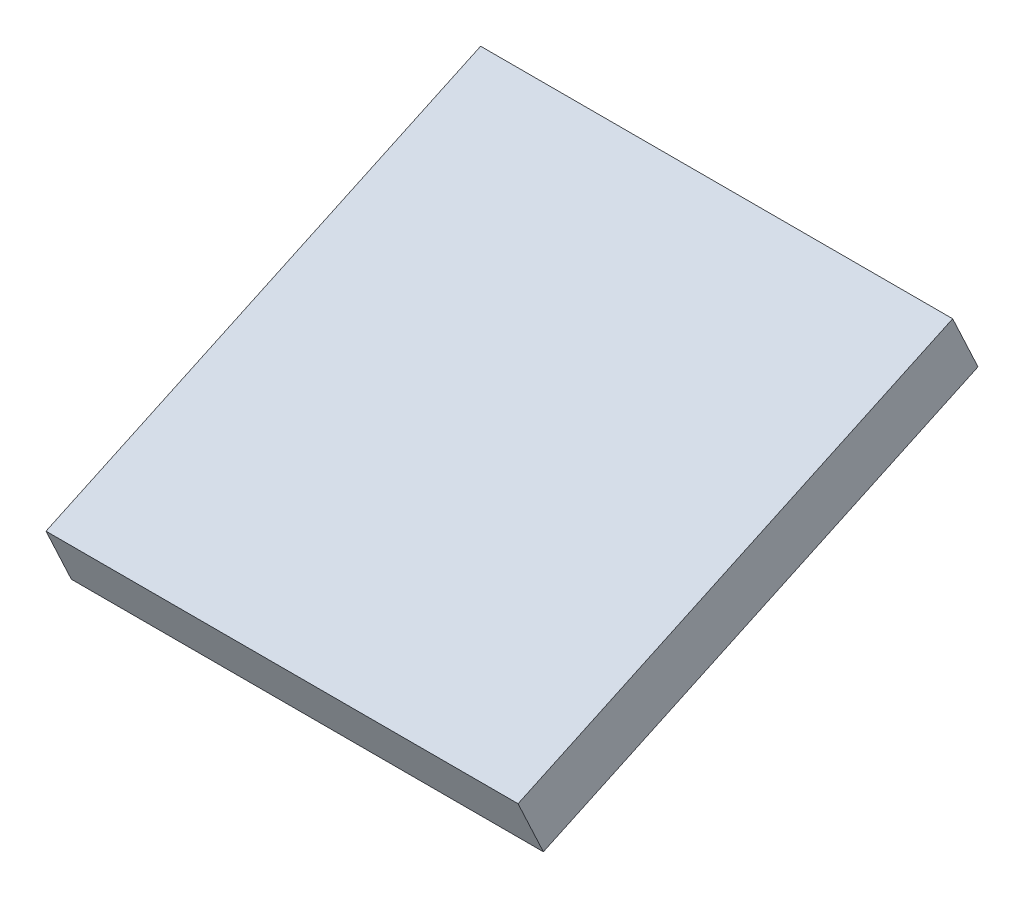
ISO-10303-21;
HEADER;
FILE_DESCRIPTION(('STEP AP214'),'2;1');
FILE_NAME('part.step','',(''),(''),'','','');
FILE_SCHEMA(('AUTOMOTIVE_DESIGN { 1 0 10303 214 1 1 1 1 }'));
ENDSEC;
DATA;
#1=APPLICATION_CONTEXT('core data for automotive mechanical design processes');
#2=APPLICATION_PROTOCOL_DEFINITION('international standard','automotive_design',2000,#1);
#3=PRODUCT_CONTEXT('',#1,'mechanical');
#4=PRODUCT('Part','Part','',(#3));
#5=PRODUCT_RELATED_PRODUCT_CATEGORY('part','',(#4));
#6=PRODUCT_DEFINITION_FORMATION('','',#4);
#7=PRODUCT_DEFINITION_CONTEXT('part definition',#1,'design');
#8=PRODUCT_DEFINITION('design','',#6,#7);
#9=PRODUCT_DEFINITION_SHAPE('','',#8);
#10=(LENGTH_UNIT() NAMED_UNIT(*) SI_UNIT(.MILLI.,.METRE.));
#11=(NAMED_UNIT(*) PLANE_ANGLE_UNIT() SI_UNIT($,.RADIAN.));
#12=(NAMED_UNIT(*) SI_UNIT($,.STERADIAN.) SOLID_ANGLE_UNIT());
#13=UNCERTAINTY_MEASURE_WITH_UNIT(LENGTH_MEASURE(1.E-05),#10,'distance_accuracy_value','');
#14=(GEOMETRIC_REPRESENTATION_CONTEXT(3) GLOBAL_UNCERTAINTY_ASSIGNED_CONTEXT((#13)) GLOBAL_UNIT_ASSIGNED_CONTEXT((#10,
#11,#12)) REPRESENTATION_CONTEXT('',''));
#15=CARTESIAN_POINT('',(0.,0.,0.));
#16=DIRECTION('',(0.,0.,1.));
#17=DIRECTION('',(1.,0.,0.));
#18=AXIS2_PLACEMENT_3D('',#15,#16,#17);
#19=CARTESIAN_POINT('',(-100.0125,42.9380153928551,0.));
#20=DIRECTION('',(0.,0.422618261740701,-0.906307787036649));
#21=DIRECTION('',(0.,0.906307787036649,0.422618261740701));
#22=AXIS2_PLACEMENT_3D('',#19,#20,#21);
#23=PLANE('',#22);
#24=DIRECTION('',(0.,0.906307787036649,0.422618261740701));
#25=VECTOR('',#24,1.);
#26=CARTESIAN_POINT('',(0.,42.9380153928551,0.));
#27=LINE('',#26,#25);
#28=CARTESIAN_POINT('',(0.,42.9380153928551,0.));
#29=VERTEX_POINT('',#28);
#30=CARTESIAN_POINT('',(0.,54.4481242882206,5.36725192410693));
#31=VERTEX_POINT('',#30);
#32=EDGE_CURVE('E97',#29,#31,#27,.T.);
#33=ORIENTED_EDGE('',*,*,#32,.F.);
#34=DIRECTION('',(1.,0.,0.));
#35=VECTOR('',#34,1.);
#36=CARTESIAN_POINT('',(-100.0125,42.9380153928551,0.));
#37=LINE('',#36,#35);
#38=CARTESIAN_POINT('',(-100.0125,42.9380153928551,0.));
#39=VERTEX_POINT('',#38);
#40=EDGE_CURVE('E11',#39,#29,#37,.T.);
#41=ORIENTED_EDGE('',*,*,#40,.F.);
#42=DIRECTION('',(0.,0.906307787036649,0.422618261740701));
#43=VECTOR('',#42,1.);
#44=CARTESIAN_POINT('',(-100.0125,42.9380153928551,0.));
#45=LINE('',#44,#43);
#46=CARTESIAN_POINT('',(-100.0125,54.4481242882206,5.36725192410693));
#47=VERTEX_POINT('',#46);
#48=EDGE_CURVE('E91',#39,#47,#45,.T.);
#49=ORIENTED_EDGE('',*,*,#48,.T.);
#50=DIRECTION('',(1.,0.,0.));
#51=VECTOR('',#50,1.);
#52=CARTESIAN_POINT('',(-100.0125,54.4481242882206,5.36725192410693));
#53=LINE('',#52,#51);
#54=EDGE_CURVE('E36',#47,#31,#53,.T.);
#55=ORIENTED_EDGE('',*,*,#54,.T.);
#56=EDGE_LOOP('',(#33,#41,#49,#55));
#57=FACE_BOUND('',#56,.T.);
#58=ADVANCED_FACE('F33',(#57),#23,.T.);
#59=CARTESIAN_POINT('',(-100.0125,0.,92.0808711629236));
#60=DIRECTION('',(0.,-0.90630778703665,-0.4226182617407));
#61=DIRECTION('',(0.,0.4226182617407,-0.90630778703665));
#62=AXIS2_PLACEMENT_3D('',#59,#60,#61);
#63=PLANE('',#62);
#64=DIRECTION('',(0.,0.4226182617407,-0.906307787036649));
#65=VECTOR('',#64,1.);
#66=CARTESIAN_POINT('',(0.,0.,92.0808711629236));
#67=LINE('',#66,#65);
#68=CARTESIAN_POINT('',(0.,0.,92.0808711629236));
#69=VERTEX_POINT('',#68);
#70=EDGE_CURVE('E93',#69,#29,#67,.T.);
#71=ORIENTED_EDGE('',*,*,#70,.F.);
#72=DIRECTION('',(1.,0.,0.));
#73=VECTOR('',#72,1.);
#74=CARTESIAN_POINT('',(-100.0125,0.,92.0808711629236));
#75=LINE('',#74,#73);
#76=CARTESIAN_POINT('',(-100.0125,0.,92.0808711629236));
#77=VERTEX_POINT('',#76);
#78=EDGE_CURVE('E42',#77,#69,#75,.T.);
#79=ORIENTED_EDGE('',*,*,#78,.F.);
#80=DIRECTION('',(0.,0.4226182617407,-0.906307787036649));
#81=VECTOR('',#80,1.);
#82=CARTESIAN_POINT('',(-100.0125,0.,92.0808711629236));
#83=LINE('',#82,#81);
#84=EDGE_CURVE('E88',#77,#39,#83,.T.);
#85=ORIENTED_EDGE('',*,*,#84,.T.);
#86=ORIENTED_EDGE('',*,*,#40,.T.);
#87=EDGE_LOOP('',(#71,#79,#85,#86));
#88=FACE_BOUND('',#87,.T.);
#89=ADVANCED_FACE('F107',(#88),#63,.T.);
#90=CARTESIAN_POINT('',(-100.0125,11.5101088953654,97.4481230870305));
#91=DIRECTION('',(0.,-0.4226182617407,0.90630778703665));
#92=DIRECTION('',(0.,-0.90630778703665,-0.4226182617407));
#93=AXIS2_PLACEMENT_3D('',#90,#91,#92);
#94=PLANE('',#93);
#95=DIRECTION('',(0.,-0.90630778703665,-0.4226182617407));
#96=VECTOR('',#95,1.);
#97=CARTESIAN_POINT('',(0.,11.5101088953654,97.4481230870305));
#98=LINE('',#97,#96);
#99=CARTESIAN_POINT('',(0.,11.5101088953654,97.4481230870305));
#100=VERTEX_POINT('',#99);
#101=EDGE_CURVE('E83',#100,#69,#98,.T.);
#102=ORIENTED_EDGE('',*,*,#101,.F.);
#103=DIRECTION('',(1.,0.,0.));
#104=VECTOR('',#103,1.);
#105=CARTESIAN_POINT('',(-100.0125,11.5101088953654,97.4481230870305));
#106=LINE('',#105,#104);
#107=CARTESIAN_POINT('',(-100.0125,11.5101088953654,97.4481230870305));
#108=VERTEX_POINT('',#107);
#109=EDGE_CURVE('E78',#108,#100,#106,.T.);
#110=ORIENTED_EDGE('',*,*,#109,.F.);
#111=DIRECTION('',(0.,-0.90630778703665,-0.4226182617407));
#112=VECTOR('',#111,1.);
#113=CARTESIAN_POINT('',(-100.0125,11.5101088953654,97.4481230870305));
#114=LINE('',#113,#112);
#115=EDGE_CURVE('E81',#108,#77,#114,.T.);
#116=ORIENTED_EDGE('',*,*,#115,.T.);
#117=ORIENTED_EDGE('',*,*,#78,.T.);
#118=EDGE_LOOP('',(#102,#110,#116,#117));
#119=FACE_BOUND('',#118,.T.);
#120=ADVANCED_FACE('F80',(#119),#94,.T.);
#121=CARTESIAN_POINT('',(-100.0125,54.4481242882206,5.36725192410693));
#122=DIRECTION('',(0.,0.906307787036649,0.422618261740701));
#123=DIRECTION('',(0.,-0.422618261740701,0.906307787036649));
#124=AXIS2_PLACEMENT_3D('',#121,#122,#123);
#125=PLANE('',#124);
#126=DIRECTION('',(0.,-0.422618261740701,0.906307787036649));
#127=VECTOR('',#126,1.);
#128=CARTESIAN_POINT('',(0.,54.4481242882206,5.36725192410693));
#129=LINE('',#128,#127);
#130=EDGE_CURVE('E100',#31,#100,#129,.T.);
#131=ORIENTED_EDGE('',*,*,#130,.F.);
#132=ORIENTED_EDGE('',*,*,#54,.F.);
#133=DIRECTION('',(0.,-0.422618261740701,0.906307787036649));
#134=VECTOR('',#133,1.);
#135=CARTESIAN_POINT('',(-100.0125,54.4481242882206,5.36725192410693));
#136=LINE('',#135,#134);
#137=EDGE_CURVE('E87',#47,#108,#136,.T.);
#138=ORIENTED_EDGE('',*,*,#137,.T.);
#139=ORIENTED_EDGE('',*,*,#109,.T.);
#140=EDGE_LOOP('',(#131,#132,#138,#139));
#141=FACE_BOUND('',#140,.T.);
#142=ADVANCED_FACE('F90',(#141),#125,.T.);
#143=CARTESIAN_POINT('',(-100.0125,0.,0.));
#144=DIRECTION('',(1.,0.,0.));
#145=DIRECTION('',(0.,0.,-1.));
#146=AXIS2_PLACEMENT_3D('',#143,#144,#145);
#147=PLANE('',#146);
#148=ORIENTED_EDGE('',*,*,#48,.F.);
#149=ORIENTED_EDGE('',*,*,#84,.F.);
#150=ORIENTED_EDGE('',*,*,#115,.F.);
#151=ORIENTED_EDGE('',*,*,#137,.F.);
#152=EDGE_LOOP('',(#148,#149,#150,#151));
#153=FACE_BOUND('',#152,.T.);
#154=ADVANCED_FACE('F86',(#153),#147,.F.);
#155=CARTESIAN_POINT('',(0.,0.,0.));
#156=DIRECTION('',(1.,0.,0.));
#157=DIRECTION('',(0.,0.,-1.));
#158=AXIS2_PLACEMENT_3D('',#155,#156,#157);
#159=PLANE('',#158);
#160=ORIENTED_EDGE('',*,*,#32,.T.);
#161=ORIENTED_EDGE('',*,*,#130,.T.);
#162=ORIENTED_EDGE('',*,*,#101,.T.);
#163=ORIENTED_EDGE('',*,*,#70,.T.);
#164=EDGE_LOOP('',(#160,#161,#162,#163));
#165=FACE_BOUND('',#164,.T.);
#166=ADVANCED_FACE('F106',(#165),#159,.T.);
#167=CLOSED_SHELL('',(#58,#89,#120,#142,#154,#166));
#168=MANIFOLD_SOLID_BREP('B2',#167);
#169=ADVANCED_BREP_SHAPE_REPRESENTATION('',(#18,#168),#14);
#170=SHAPE_DEFINITION_REPRESENTATION(#9,#169);
ENDSEC;
END-ISO-10303-21;
